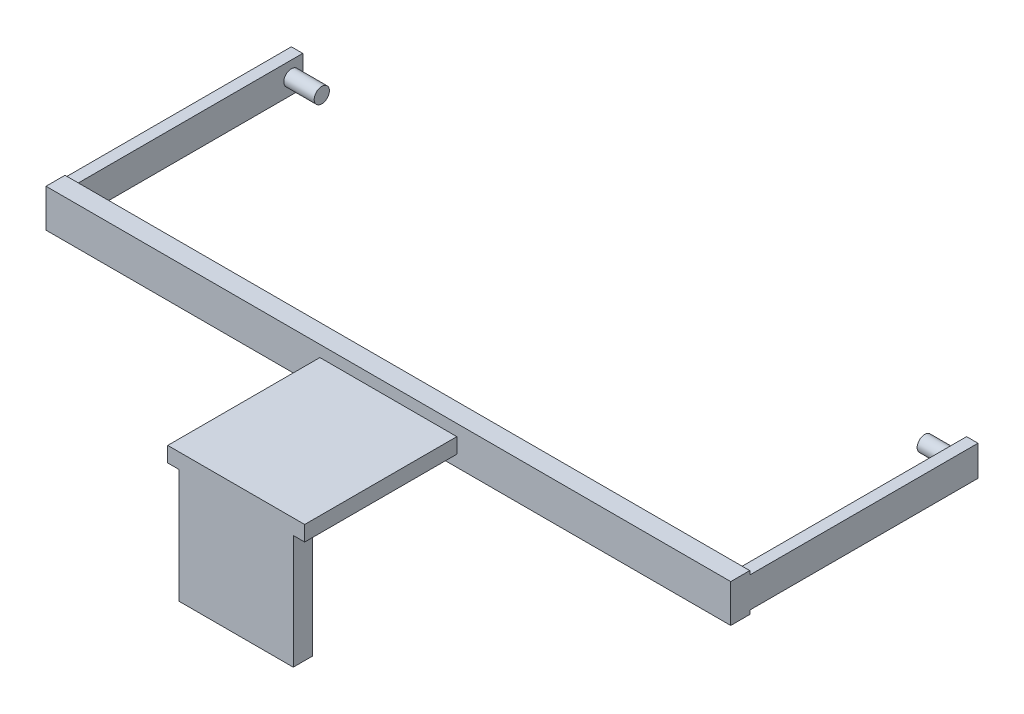
ISO-10303-21;
HEADER;
FILE_DESCRIPTION(('STEP AP214'),'2;1');
FILE_NAME('part.step','',(''),(''),'','','');
FILE_SCHEMA(('AUTOMOTIVE_DESIGN { 1 0 10303 214 1 1 1 1 }'));
ENDSEC;
DATA;
#1=APPLICATION_CONTEXT('core data for automotive mechanical design processes');
#2=APPLICATION_PROTOCOL_DEFINITION('international standard','automotive_design',2000,#1);
#3=PRODUCT_CONTEXT('',#1,'mechanical');
#4=PRODUCT('Part','Part','',(#3));
#5=PRODUCT_RELATED_PRODUCT_CATEGORY('part','',(#4));
#6=PRODUCT_DEFINITION_FORMATION('','',#4);
#7=PRODUCT_DEFINITION_CONTEXT('part definition',#1,'design');
#8=PRODUCT_DEFINITION('design','',#6,#7);
#9=PRODUCT_DEFINITION_SHAPE('','',#8);
#10=(LENGTH_UNIT() NAMED_UNIT(*) SI_UNIT(.MILLI.,.METRE.));
#11=(NAMED_UNIT(*) PLANE_ANGLE_UNIT() SI_UNIT($,.RADIAN.));
#12=(NAMED_UNIT(*) SI_UNIT($,.STERADIAN.) SOLID_ANGLE_UNIT());
#13=UNCERTAINTY_MEASURE_WITH_UNIT(LENGTH_MEASURE(1.E-05),#10,'distance_accuracy_value','');
#14=(GEOMETRIC_REPRESENTATION_CONTEXT(3) GLOBAL_UNCERTAINTY_ASSIGNED_CONTEXT((#13)) GLOBAL_UNIT_ASSIGNED_CONTEXT((#10,
#11,#12)) REPRESENTATION_CONTEXT('',''));
#15=CARTESIAN_POINT('',(0.,0.,0.));
#16=DIRECTION('',(0.,0.,1.));
#17=DIRECTION('',(1.,0.,0.));
#18=AXIS2_PLACEMENT_3D('',#15,#16,#17);
#19=CARTESIAN_POINT('',(-90.,10.,-2.5));
#20=DIRECTION('',(0.,0.,1.));
#21=DIRECTION('',(1.,0.,0.));
#22=AXIS2_PLACEMENT_3D('',#19,#20,#21);
#23=PLANE('',#22);
#24=DIRECTION('',(1.,0.,0.));
#25=VECTOR('',#24,1.);
#26=CARTESIAN_POINT('',(-87.5,9.,-2.5));
#27=LINE('',#26,#25);
#28=CARTESIAN_POINT('',(-90.,9.,-2.5));
#29=VERTEX_POINT('',#28);
#30=CARTESIAN_POINT('',(-87.5,9.,-2.5));
#31=VERTEX_POINT('',#30);
#32=EDGE_CURVE('E380',#29,#31,#27,.T.);
#33=ORIENTED_EDGE('',*,*,#32,.F.);
#34=DIRECTION('',(0.,-1.,0.));
#35=VECTOR('',#34,1.);
#36=CARTESIAN_POINT('',(-90.,10.,-2.5));
#37=LINE('',#36,#35);
#38=CARTESIAN_POINT('',(-90.,10.,-2.5));
#39=VERTEX_POINT('',#38);
#40=EDGE_CURVE('E329',#39,#29,#37,.T.);
#41=ORIENTED_EDGE('',*,*,#40,.F.);
#42=DIRECTION('',(-1.,0.,0.));
#43=VECTOR('',#42,1.);
#44=CARTESIAN_POINT('',(-90.,10.,-2.5));
#45=LINE('',#44,#43);
#46=CARTESIAN_POINT('',(90.,10.,-2.5));
#47=VERTEX_POINT('',#46);
#48=EDGE_CURVE('E307',#47,#39,#45,.T.);
#49=ORIENTED_EDGE('',*,*,#48,.F.);
#50=DIRECTION('',(0.,-1.,0.));
#51=VECTOR('',#50,1.);
#52=CARTESIAN_POINT('',(90.,10.,-2.5));
#53=LINE('',#52,#51);
#54=CARTESIAN_POINT('',(90.,9.,-2.5));
#55=VERTEX_POINT('',#54);
#56=EDGE_CURVE('E334',#47,#55,#53,.T.);
#57=ORIENTED_EDGE('',*,*,#56,.T.);
#58=DIRECTION('',(1.,0.,0.));
#59=VECTOR('',#58,1.);
#60=CARTESIAN_POINT('',(90.,9.,-2.5));
#61=LINE('',#60,#59);
#62=CARTESIAN_POINT('',(87.,9.,-2.5));
#63=VERTEX_POINT('',#62);
#64=EDGE_CURVE('E287',#63,#55,#61,.T.);
#65=ORIENTED_EDGE('',*,*,#64,.F.);
#66=DIRECTION('',(0.,1.,0.));
#67=VECTOR('',#66,1.);
#68=CARTESIAN_POINT('',(87.,1.,-2.5));
#69=LINE('',#68,#67);
#70=CARTESIAN_POINT('',(87.,1.,-2.5));
#71=VERTEX_POINT('',#70);
#72=EDGE_CURVE('E273',#71,#63,#69,.T.);
#73=ORIENTED_EDGE('',*,*,#72,.F.);
#74=DIRECTION('',(-1.,0.,0.));
#75=VECTOR('',#74,1.);
#76=CARTESIAN_POINT('',(90.,1.,-2.5));
#77=LINE('',#76,#75);
#78=CARTESIAN_POINT('',(90.,1.,-2.5));
#79=VERTEX_POINT('',#78);
#80=EDGE_CURVE('E278',#79,#71,#77,.T.);
#81=ORIENTED_EDGE('',*,*,#80,.F.);
#82=CARTESIAN_POINT('',(90.,0.,-2.5));
#83=VERTEX_POINT('',#82);
#84=EDGE_CURVE('E332',#79,#83,#53,.T.);
#85=ORIENTED_EDGE('',*,*,#84,.T.);
#86=DIRECTION('',(-1.,0.,0.));
#87=VECTOR('',#86,1.);
#88=CARTESIAN_POINT('',(-90.,0.,-2.5));
#89=LINE('',#88,#87);
#90=CARTESIAN_POINT('',(-90.,0.,-2.5));
#91=VERTEX_POINT('',#90);
#92=EDGE_CURVE('E317',#83,#91,#89,.T.);
#93=ORIENTED_EDGE('',*,*,#92,.T.);
#94=CARTESIAN_POINT('',(-90.,1.,-2.5));
#95=VERTEX_POINT('',#94);
#96=EDGE_CURVE('E328',#95,#91,#37,.T.);
#97=ORIENTED_EDGE('',*,*,#96,.F.);
#98=DIRECTION('',(-1.,0.,0.));
#99=VECTOR('',#98,1.);
#100=CARTESIAN_POINT('',(-87.5,1.,-2.5));
#101=LINE('',#100,#99);
#102=CARTESIAN_POINT('',(-87.5,1.,-2.5));
#103=VERTEX_POINT('',#102);
#104=EDGE_CURVE('E51',#103,#95,#101,.T.);
#105=ORIENTED_EDGE('',*,*,#104,.F.);
#106=DIRECTION('',(0.,-1.,0.));
#107=VECTOR('',#106,1.);
#108=CARTESIAN_POINT('',(-87.5,1.,-2.5));
#109=LINE('',#108,#107);
#110=EDGE_CURVE('E381',#31,#103,#109,.T.);
#111=ORIENTED_EDGE('',*,*,#110,.F.);
#112=EDGE_LOOP('',(#33,#41,#49,#57,#65,#73,#81,#85,#93,#97,#105,#111));
#113=FACE_BOUND('',#112,.T.);
#114=ADVANCED_FACE('F36',(#113),#23,.F.);
#115=CARTESIAN_POINT('',(-18.,3.,42.5));
#116=DIRECTION('',(0.,1.,0.));
#117=DIRECTION('',(0.,0.,1.));
#118=AXIS2_PLACEMENT_3D('',#115,#116,#117);
#119=PLANE('',#118);
#120=DIRECTION('',(0.,0.,-1.));
#121=VECTOR('',#120,1.);
#122=CARTESIAN_POINT('',(-15.,3.,37.5));
#123=LINE('',#122,#121);
#124=CARTESIAN_POINT('',(-15.,3.,42.5));
#125=VERTEX_POINT('',#124);
#126=CARTESIAN_POINT('',(-15.,3.,37.5));
#127=VERTEX_POINT('',#126);
#128=EDGE_CURVE('E206',#125,#127,#123,.T.);
#129=ORIENTED_EDGE('',*,*,#128,.F.);
#130=DIRECTION('',(1.,0.,0.));
#131=VECTOR('',#130,1.);
#132=CARTESIAN_POINT('',(-18.,3.,42.5));
#133=LINE('',#132,#131);
#134=CARTESIAN_POINT('',(-18.,3.,42.5));
#135=VERTEX_POINT('',#134);
#136=EDGE_CURVE('E245',#135,#125,#133,.T.);
#137=ORIENTED_EDGE('',*,*,#136,.F.);
#138=DIRECTION('',(0.,0.,-1.));
#139=VECTOR('',#138,1.);
#140=CARTESIAN_POINT('',(-18.,3.,42.5));
#141=LINE('',#140,#139);
#142=CARTESIAN_POINT('',(-18.,3.,2.5));
#143=VERTEX_POINT('',#142);
#144=EDGE_CURVE('E261',#135,#143,#141,.T.);
#145=ORIENTED_EDGE('',*,*,#144,.T.);
#146=DIRECTION('',(1.,0.,0.));
#147=VECTOR('',#146,1.);
#148=CARTESIAN_POINT('',(-18.,3.,2.5));
#149=LINE('',#148,#147);
#150=CARTESIAN_POINT('',(18.,3.,2.5));
#151=VERTEX_POINT('',#150);
#152=EDGE_CURVE('E240',#143,#151,#149,.T.);
#153=ORIENTED_EDGE('',*,*,#152,.T.);
#154=DIRECTION('',(0.,0.,-1.));
#155=VECTOR('',#154,1.);
#156=CARTESIAN_POINT('',(18.,3.,42.5));
#157=LINE('',#156,#155);
#158=CARTESIAN_POINT('',(18.,3.,42.5));
#159=VERTEX_POINT('',#158);
#160=EDGE_CURVE('E248',#159,#151,#157,.T.);
#161=ORIENTED_EDGE('',*,*,#160,.F.);
#162=CARTESIAN_POINT('',(15.,3.,42.5));
#163=VERTEX_POINT('',#162);
#164=EDGE_CURVE('E244',#163,#159,#133,.T.);
#165=ORIENTED_EDGE('',*,*,#164,.F.);
#166=DIRECTION('',(0.,0.,1.));
#167=VECTOR('',#166,1.);
#168=CARTESIAN_POINT('',(15.,3.,37.5));
#169=LINE('',#168,#167);
#170=CARTESIAN_POINT('',(15.,3.,37.5));
#171=VERTEX_POINT('',#170);
#172=EDGE_CURVE('E219',#171,#163,#169,.T.);
#173=ORIENTED_EDGE('',*,*,#172,.F.);
#174=DIRECTION('',(1.,0.,0.));
#175=VECTOR('',#174,1.);
#176=CARTESIAN_POINT('',(15.,3.,37.5));
#177=LINE('',#176,#175);
#178=EDGE_CURVE('E209',#127,#171,#177,.T.);
#179=ORIENTED_EDGE('',*,*,#178,.F.);
#180=EDGE_LOOP('',(#129,#137,#145,#153,#161,#165,#173,#179));
#181=FACE_BOUND('',#180,.T.);
#182=ADVANCED_FACE('F418',(#181),#119,.F.);
#183=CARTESIAN_POINT('',(-90.,10.,2.5));
#184=DIRECTION('',(0.,0.,-1.));
#185=DIRECTION('',(-1.,0.,0.));
#186=AXIS2_PLACEMENT_3D('',#183,#184,#185);
#187=PLANE('',#186);
#188=DIRECTION('',(1.,0.,0.));
#189=VECTOR('',#188,1.);
#190=CARTESIAN_POINT('',(-90.,0.,2.5));
#191=LINE('',#190,#189);
#192=CARTESIAN_POINT('',(-90.,0.,2.5));
#193=VERTEX_POINT('',#192);
#194=CARTESIAN_POINT('',(90.,0.,2.5));
#195=VERTEX_POINT('',#194);
#196=EDGE_CURVE('E308',#193,#195,#191,.T.);
#197=ORIENTED_EDGE('',*,*,#196,.T.);
#198=DIRECTION('',(0.,-1.,0.));
#199=VECTOR('',#198,1.);
#200=CARTESIAN_POINT('',(90.,10.,2.5));
#201=LINE('',#200,#199);
#202=CARTESIAN_POINT('',(90.,10.,2.5));
#203=VERTEX_POINT('',#202);
#204=EDGE_CURVE('E314',#203,#195,#201,.T.);
#205=ORIENTED_EDGE('',*,*,#204,.F.);
#206=DIRECTION('',(1.,0.,0.));
#207=VECTOR('',#206,1.);
#208=CARTESIAN_POINT('',(-90.,10.,2.5));
#209=LINE('',#208,#207);
#210=CARTESIAN_POINT('',(-90.,10.,2.5));
#211=VERTEX_POINT('',#210);
#212=EDGE_CURVE('E312',#211,#203,#209,.T.);
#213=ORIENTED_EDGE('',*,*,#212,.F.);
#214=DIRECTION('',(0.,-1.,0.));
#215=VECTOR('',#214,1.);
#216=CARTESIAN_POINT('',(-90.,10.,2.5));
#217=LINE('',#216,#215);
#218=EDGE_CURVE('E325',#211,#193,#217,.T.);
#219=ORIENTED_EDGE('',*,*,#218,.T.);
#220=EDGE_LOOP('',(#197,#205,#213,#219));
#221=FACE_BOUND('',#220,.T.);
#222=DIRECTION('',(0.,1.,0.));
#223=VECTOR('',#222,1.);
#224=CARTESIAN_POINT('',(18.,7.,2.5));
#225=LINE('',#224,#223);
#226=CARTESIAN_POINT('',(18.,7.,2.5));
#227=VERTEX_POINT('',#226);
#228=EDGE_CURVE('E235',#151,#227,#225,.T.);
#229=ORIENTED_EDGE('',*,*,#228,.F.);
#230=ORIENTED_EDGE('',*,*,#152,.F.);
#231=DIRECTION('',(0.,-1.,0.));
#232=VECTOR('',#231,1.);
#233=CARTESIAN_POINT('',(-18.,7.,2.5));
#234=LINE('',#233,#232);
#235=CARTESIAN_POINT('',(-18.,7.,2.5));
#236=VERTEX_POINT('',#235);
#237=EDGE_CURVE('E254',#236,#143,#234,.T.);
#238=ORIENTED_EDGE('',*,*,#237,.F.);
#239=DIRECTION('',(-1.,0.,0.));
#240=VECTOR('',#239,1.);
#241=CARTESIAN_POINT('',(-18.,7.,2.5));
#242=LINE('',#241,#240);
#243=EDGE_CURVE('E251',#227,#236,#242,.T.);
#244=ORIENTED_EDGE('',*,*,#243,.F.);
#245=EDGE_LOOP('',(#229,#230,#238,#244));
#246=FACE_BOUND('',#245,.T.);
#247=ADVANCED_FACE('F371',(#221,#246),#187,.F.);
#248=CARTESIAN_POINT('',(90.,10.,-2.5));
#249=DIRECTION('',(-1.,0.,0.));
#250=DIRECTION('',(0.,0.,1.));
#251=AXIS2_PLACEMENT_3D('',#248,#249,#250);
#252=PLANE('',#251);
#253=DIRECTION('',(0.,0.,-1.));
#254=VECTOR('',#253,1.);
#255=CARTESIAN_POINT('',(90.,0.,-2.5));
#256=LINE('',#255,#254);
#257=EDGE_CURVE('E303',#195,#83,#256,.T.);
#258=ORIENTED_EDGE('',*,*,#257,.T.);
#259=ORIENTED_EDGE('',*,*,#84,.F.);
#260=DIRECTION('',(0.,0.,1.));
#261=VECTOR('',#260,1.);
#262=CARTESIAN_POINT('',(90.,1.,-62.5));
#263=LINE('',#262,#261);
#264=CARTESIAN_POINT('',(90.,1.,-62.5));
#265=VERTEX_POINT('',#264);
#266=EDGE_CURVE('E294',#265,#79,#263,.T.);
#267=ORIENTED_EDGE('',*,*,#266,.F.);
#268=DIRECTION('',(0.,-1.,0.));
#269=VECTOR('',#268,1.);
#270=CARTESIAN_POINT('',(90.,1.,-62.5));
#271=LINE('',#270,#269);
#272=CARTESIAN_POINT('',(90.,9.,-62.5));
#273=VERTEX_POINT('',#272);
#274=EDGE_CURVE('E280',#273,#265,#271,.T.);
#275=ORIENTED_EDGE('',*,*,#274,.F.);
#276=DIRECTION('',(0.,0.,1.));
#277=VECTOR('',#276,1.);
#278=CARTESIAN_POINT('',(90.,9.,-62.5));
#279=LINE('',#278,#277);
#280=EDGE_CURVE('E297',#273,#55,#279,.T.);
#281=ORIENTED_EDGE('',*,*,#280,.T.);
#282=ORIENTED_EDGE('',*,*,#56,.F.);
#283=DIRECTION('',(0.,0.,-1.));
#284=VECTOR('',#283,1.);
#285=CARTESIAN_POINT('',(90.,10.,-2.5));
#286=LINE('',#285,#284);
#287=EDGE_CURVE('E304',#203,#47,#286,.T.);
#288=ORIENTED_EDGE('',*,*,#287,.F.);
#289=ORIENTED_EDGE('',*,*,#204,.T.);
#290=EDGE_LOOP('',(#258,#259,#267,#275,#281,#282,#288,#289));
#291=FACE_BOUND('',#290,.T.);
#292=ADVANCED_FACE('F38',(#291),#252,.F.);
#293=CARTESIAN_POINT('',(-90.,10.,-2.5));
#294=DIRECTION('',(1.,0.,0.));
#295=DIRECTION('',(0.,0.,-1.));
#296=AXIS2_PLACEMENT_3D('',#293,#294,#295);
#297=PLANE('',#296);
#298=DIRECTION('',(0.,0.,1.));
#299=VECTOR('',#298,1.);
#300=CARTESIAN_POINT('',(-90.,0.,-2.5));
#301=LINE('',#300,#299);
#302=EDGE_CURVE('E320',#91,#193,#301,.T.);
#303=ORIENTED_EDGE('',*,*,#302,.T.);
#304=ORIENTED_EDGE('',*,*,#218,.F.);
#305=DIRECTION('',(0.,0.,1.));
#306=VECTOR('',#305,1.);
#307=CARTESIAN_POINT('',(-90.,10.,-2.5));
#308=LINE('',#307,#306);
#309=EDGE_CURVE('E310',#39,#211,#308,.T.);
#310=ORIENTED_EDGE('',*,*,#309,.F.);
#311=ORIENTED_EDGE('',*,*,#40,.T.);
#312=EDGE_CURVE('E333',#29,#95,#37,.T.);
#313=ORIENTED_EDGE('',*,*,#312,.T.);
#314=ORIENTED_EDGE('',*,*,#96,.T.);
#315=EDGE_LOOP('',(#303,#304,#310,#311,#313,#314));
#316=FACE_BOUND('',#315,.T.);
#317=ADVANCED_FACE('F366',(#316),#297,.F.);
#318=CARTESIAN_POINT('',(0.,10.,0.));
#319=DIRECTION('',(0.,1.,0.));
#320=DIRECTION('',(0.,0.,1.));
#321=AXIS2_PLACEMENT_3D('',#318,#319,#320);
#322=PLANE('',#321);
#323=ORIENTED_EDGE('',*,*,#287,.T.);
#324=ORIENTED_EDGE('',*,*,#48,.T.);
#325=ORIENTED_EDGE('',*,*,#309,.T.);
#326=ORIENTED_EDGE('',*,*,#212,.T.);
#327=EDGE_LOOP('',(#323,#324,#325,#326));
#328=FACE_BOUND('',#327,.T.);
#329=ADVANCED_FACE('F376',(#328),#322,.T.);
#330=CARTESIAN_POINT('',(0.,0.,0.));
#331=DIRECTION('',(0.,1.,0.));
#332=DIRECTION('',(0.,0.,1.));
#333=AXIS2_PLACEMENT_3D('',#330,#331,#332);
#334=PLANE('',#333);
#335=ORIENTED_EDGE('',*,*,#257,.F.);
#336=ORIENTED_EDGE('',*,*,#196,.F.);
#337=ORIENTED_EDGE('',*,*,#302,.F.);
#338=ORIENTED_EDGE('',*,*,#92,.F.);
#339=EDGE_LOOP('',(#335,#336,#337,#338));
#340=FACE_BOUND('',#339,.T.);
#341=ADVANCED_FACE('F344',(#340),#334,.F.);
#342=CARTESIAN_POINT('',(87.,1.,-62.5));
#343=DIRECTION('',(1.,0.,0.));
#344=DIRECTION('',(0.,0.,-1.));
#345=AXIS2_PLACEMENT_3D('',#342,#343,#344);
#346=PLANE('',#345);
#347=CARTESIAN_POINT('',(87.,5.,-59.5));
#348=DIRECTION('',(1.,0.,0.));
#349=DIRECTION('',(0.,0.,-1.));
#350=AXIS2_PLACEMENT_3D('',#347,#348,#349);
#351=CIRCLE('',#350,2.);
#352=CARTESIAN_POINT('',(87.,5.,-61.5));
#353=VERTEX_POINT('',#352);
#354=EDGE_CURVE('E44',#353,#353,#351,.F.);
#355=ORIENTED_EDGE('',*,*,#354,.F.);
#356=EDGE_LOOP('',(#355));
#357=FACE_BOUND('',#356,.T.);
#358=ORIENTED_EDGE('',*,*,#72,.T.);
#359=DIRECTION('',(0.,0.,1.));
#360=VECTOR('',#359,1.);
#361=CARTESIAN_POINT('',(87.,9.,-62.5));
#362=LINE('',#361,#360);
#363=CARTESIAN_POINT('',(87.,9.,-62.5));
#364=VERTEX_POINT('',#363);
#365=EDGE_CURVE('E300',#364,#63,#362,.T.);
#366=ORIENTED_EDGE('',*,*,#365,.F.);
#367=DIRECTION('',(0.,1.,0.));
#368=VECTOR('',#367,1.);
#369=CARTESIAN_POINT('',(87.,1.,-62.5));
#370=LINE('',#369,#368);
#371=CARTESIAN_POINT('',(87.,1.,-62.5));
#372=VERTEX_POINT('',#371);
#373=EDGE_CURVE('E274',#372,#364,#370,.T.);
#374=ORIENTED_EDGE('',*,*,#373,.F.);
#375=DIRECTION('',(0.,0.,1.));
#376=VECTOR('',#375,1.);
#377=CARTESIAN_POINT('',(87.,1.,-62.5));
#378=LINE('',#377,#376);
#379=EDGE_CURVE('E284',#372,#71,#378,.T.);
#380=ORIENTED_EDGE('',*,*,#379,.T.);
#381=EDGE_LOOP('',(#358,#366,#374,#380));
#382=FACE_BOUND('',#381,.T.);
#383=ADVANCED_FACE('F340',(#357,#382),#346,.F.);
#384=CARTESIAN_POINT('',(90.,9.,-62.5));
#385=DIRECTION('',(0.,-1.,0.));
#386=DIRECTION('',(0.,0.,-1.));
#387=AXIS2_PLACEMENT_3D('',#384,#385,#386);
#388=PLANE('',#387);
#389=ORIENTED_EDGE('',*,*,#64,.T.);
#390=ORIENTED_EDGE('',*,*,#280,.F.);
#391=DIRECTION('',(1.,0.,0.));
#392=VECTOR('',#391,1.);
#393=CARTESIAN_POINT('',(90.,9.,-62.5));
#394=LINE('',#393,#392);
#395=EDGE_CURVE('E277',#364,#273,#394,.T.);
#396=ORIENTED_EDGE('',*,*,#395,.F.);
#397=ORIENTED_EDGE('',*,*,#365,.T.);
#398=EDGE_LOOP('',(#389,#390,#396,#397));
#399=FACE_BOUND('',#398,.T.);
#400=ADVANCED_FACE('F343',(#399),#388,.F.);
#401=CARTESIAN_POINT('',(90.,1.,-62.5));
#402=DIRECTION('',(0.,1.,0.));
#403=DIRECTION('',(-1.,0.,0.));
#404=AXIS2_PLACEMENT_3D('',#401,#402,#403);
#405=PLANE('',#404);
#406=ORIENTED_EDGE('',*,*,#80,.T.);
#407=ORIENTED_EDGE('',*,*,#379,.F.);
#408=DIRECTION('',(-1.,0.,0.));
#409=VECTOR('',#408,1.);
#410=CARTESIAN_POINT('',(90.,1.,-62.5));
#411=LINE('',#410,#409);
#412=EDGE_CURVE('E282',#265,#372,#411,.T.);
#413=ORIENTED_EDGE('',*,*,#412,.F.);
#414=ORIENTED_EDGE('',*,*,#266,.T.);
#415=EDGE_LOOP('',(#406,#407,#413,#414));
#416=FACE_BOUND('',#415,.T.);
#417=ADVANCED_FACE('F353',(#416),#405,.F.);
#418=CARTESIAN_POINT('',(0.,0.,-62.5));
#419=DIRECTION('',(0.,0.,1.));
#420=DIRECTION('',(1.,0.,0.));
#421=AXIS2_PLACEMENT_3D('',#418,#419,#420);
#422=PLANE('',#421);
#423=ORIENTED_EDGE('',*,*,#373,.T.);
#424=ORIENTED_EDGE('',*,*,#395,.T.);
#425=ORIENTED_EDGE('',*,*,#274,.T.);
#426=ORIENTED_EDGE('',*,*,#412,.T.);
#427=EDGE_LOOP('',(#423,#424,#425,#426));
#428=FACE_BOUND('',#427,.T.);
#429=ADVANCED_FACE('F438',(#428),#422,.F.);
#430=CARTESIAN_POINT('',(79.,5.,-59.5));
#431=DIRECTION('',(1.,0.,0.));
#432=DIRECTION('',(0.,0.,-1.));
#433=AXIS2_PLACEMENT_3D('',#430,#431,#432);
#434=CYLINDRICAL_SURFACE('',#433,2.);
#435=CARTESIAN_POINT('',(79.,5.,-59.5));
#436=DIRECTION('',(-1.,0.,0.));
#437=DIRECTION('',(0.,0.,1.));
#438=AXIS2_PLACEMENT_3D('',#435,#436,#437);
#439=CIRCLE('',#438,2.);
#440=CARTESIAN_POINT('',(79.,5.,-57.5));
#441=VERTEX_POINT('',#440);
#442=EDGE_CURVE('E270',#441,#441,#439,.T.);
#443=ORIENTED_EDGE('',*,*,#442,.F.);
#444=EDGE_LOOP('',(#443));
#445=FACE_BOUND('',#444,.T.);
#446=ORIENTED_EDGE('',*,*,#354,.T.);
#447=EDGE_LOOP('',(#446));
#448=FACE_BOUND('',#447,.T.);
#449=ADVANCED_FACE('F338',(#445,#448),#434,.T.);
#450=CARTESIAN_POINT('',(79.,5.,-59.5));
#451=DIRECTION('',(-1.,0.,0.));
#452=DIRECTION('',(0.,0.,1.));
#453=AXIS2_PLACEMENT_3D('',#450,#451,#452);
#454=PLANE('',#453);
#455=ORIENTED_EDGE('',*,*,#442,.T.);
#456=EDGE_LOOP('',(#455));
#457=FACE_BOUND('',#456,.T.);
#458=ADVANCED_FACE('F444',(#457),#454,.T.);
#459=CARTESIAN_POINT('',(18.,7.,42.5));
#460=DIRECTION('',(-1.,0.,0.));
#461=DIRECTION('',(0.,0.,1.));
#462=AXIS2_PLACEMENT_3D('',#459,#460,#461);
#463=PLANE('',#462);
#464=ORIENTED_EDGE('',*,*,#228,.T.);
#465=DIRECTION('',(0.,0.,-1.));
#466=VECTOR('',#465,1.);
#467=CARTESIAN_POINT('',(18.,7.,42.5));
#468=LINE('',#467,#466);
#469=CARTESIAN_POINT('',(18.,7.,42.5));
#470=VERTEX_POINT('',#469);
#471=EDGE_CURVE('E267',#470,#227,#468,.T.);
#472=ORIENTED_EDGE('',*,*,#471,.F.);
#473=DIRECTION('',(0.,1.,0.));
#474=VECTOR('',#473,1.);
#475=CARTESIAN_POINT('',(18.,7.,42.5));
#476=LINE('',#475,#474);
#477=EDGE_CURVE('E236',#159,#470,#476,.T.);
#478=ORIENTED_EDGE('',*,*,#477,.F.);
#479=ORIENTED_EDGE('',*,*,#160,.T.);
#480=EDGE_LOOP('',(#464,#472,#478,#479));
#481=FACE_BOUND('',#480,.T.);
#482=ADVANCED_FACE('F448',(#481),#463,.F.);
#483=CARTESIAN_POINT('',(-18.,7.,42.5));
#484=DIRECTION('',(0.,-1.,0.));
#485=DIRECTION('',(0.,0.,-1.));
#486=AXIS2_PLACEMENT_3D('',#483,#484,#485);
#487=PLANE('',#486);
#488=ORIENTED_EDGE('',*,*,#243,.T.);
#489=DIRECTION('',(0.,0.,-1.));
#490=VECTOR('',#489,1.);
#491=CARTESIAN_POINT('',(-18.,7.,42.5));
#492=LINE('',#491,#490);
#493=CARTESIAN_POINT('',(-18.,7.,42.5));
#494=VERTEX_POINT('',#493);
#495=EDGE_CURVE('E264',#494,#236,#492,.T.);
#496=ORIENTED_EDGE('',*,*,#495,.F.);
#497=DIRECTION('',(-1.,0.,0.));
#498=VECTOR('',#497,1.);
#499=CARTESIAN_POINT('',(-18.,7.,42.5));
#500=LINE('',#499,#498);
#501=EDGE_CURVE('E239',#470,#494,#500,.T.);
#502=ORIENTED_EDGE('',*,*,#501,.F.);
#503=ORIENTED_EDGE('',*,*,#471,.T.);
#504=EDGE_LOOP('',(#488,#496,#502,#503));
#505=FACE_BOUND('',#504,.T.);
#506=ADVANCED_FACE('F452',(#505),#487,.F.);
#507=CARTESIAN_POINT('',(-18.,7.,42.5));
#508=DIRECTION('',(1.,0.,0.));
#509=DIRECTION('',(0.,1.,0.));
#510=AXIS2_PLACEMENT_3D('',#507,#508,#509);
#511=PLANE('',#510);
#512=ORIENTED_EDGE('',*,*,#237,.T.);
#513=ORIENTED_EDGE('',*,*,#144,.F.);
#514=DIRECTION('',(0.,-1.,0.));
#515=VECTOR('',#514,1.);
#516=CARTESIAN_POINT('',(-18.,7.,42.5));
#517=LINE('',#516,#515);
#518=EDGE_CURVE('E242',#494,#135,#517,.T.);
#519=ORIENTED_EDGE('',*,*,#518,.F.);
#520=ORIENTED_EDGE('',*,*,#495,.T.);
#521=EDGE_LOOP('',(#512,#513,#519,#520));
#522=FACE_BOUND('',#521,.T.);
#523=ADVANCED_FACE('F456',(#522),#511,.F.);
#524=CARTESIAN_POINT('',(0.,0.,42.5));
#525=DIRECTION('',(0.,0.,1.));
#526=DIRECTION('',(1.,0.,0.));
#527=AXIS2_PLACEMENT_3D('',#524,#525,#526);
#528=PLANE('',#527);
#529=ORIENTED_EDGE('',*,*,#477,.T.);
#530=ORIENTED_EDGE('',*,*,#501,.T.);
#531=ORIENTED_EDGE('',*,*,#518,.T.);
#532=ORIENTED_EDGE('',*,*,#136,.T.);
#533=DIRECTION('',(0.,1.,0.));
#534=VECTOR('',#533,1.);
#535=CARTESIAN_POINT('',(-15.,-27.,42.5));
#536=LINE('',#535,#534);
#537=CARTESIAN_POINT('',(-15.,-27.,42.5));
#538=VERTEX_POINT('',#537);
#539=EDGE_CURVE('E224',#538,#125,#536,.T.);
#540=ORIENTED_EDGE('',*,*,#539,.F.);
#541=DIRECTION('',(-1.,0.,0.));
#542=VECTOR('',#541,1.);
#543=CARTESIAN_POINT('',(15.,-27.,42.5));
#544=LINE('',#543,#542);
#545=CARTESIAN_POINT('',(15.,-27.,42.5));
#546=VERTEX_POINT('',#545);
#547=EDGE_CURVE('E223',#546,#538,#544,.T.);
#548=ORIENTED_EDGE('',*,*,#547,.F.);
#549=DIRECTION('',(0.,1.,0.));
#550=VECTOR('',#549,1.);
#551=CARTESIAN_POINT('',(15.,-27.,42.5));
#552=LINE('',#551,#550);
#553=EDGE_CURVE('E59',#546,#163,#552,.T.);
#554=ORIENTED_EDGE('',*,*,#553,.T.);
#555=ORIENTED_EDGE('',*,*,#164,.T.);
#556=EDGE_LOOP('',(#529,#530,#531,#532,#540,#548,#554,#555));
#557=FACE_BOUND('',#556,.T.);
#558=ADVANCED_FACE('F459',(#557),#528,.T.);
#559=CARTESIAN_POINT('',(-15.,-27.,37.5));
#560=DIRECTION('',(1.,0.,0.));
#561=DIRECTION('',(0.,0.,-1.));
#562=AXIS2_PLACEMENT_3D('',#559,#560,#561);
#563=PLANE('',#562);
#564=ORIENTED_EDGE('',*,*,#128,.T.);
#565=DIRECTION('',(0.,1.,0.));
#566=VECTOR('',#565,1.);
#567=CARTESIAN_POINT('',(-15.,-27.,37.5));
#568=LINE('',#567,#566);
#569=CARTESIAN_POINT('',(-15.,-27.,37.5));
#570=VERTEX_POINT('',#569);
#571=EDGE_CURVE('E233',#570,#127,#568,.T.);
#572=ORIENTED_EDGE('',*,*,#571,.F.);
#573=DIRECTION('',(0.,0.,-1.));
#574=VECTOR('',#573,1.);
#575=CARTESIAN_POINT('',(-15.,-27.,37.5));
#576=LINE('',#575,#574);
#577=EDGE_CURVE('E215',#538,#570,#576,.T.);
#578=ORIENTED_EDGE('',*,*,#577,.F.);
#579=ORIENTED_EDGE('',*,*,#539,.T.);
#580=EDGE_LOOP('',(#564,#572,#578,#579));
#581=FACE_BOUND('',#580,.T.);
#582=ADVANCED_FACE('F464',(#581),#563,.F.);
#583=CARTESIAN_POINT('',(15.,-27.,37.5));
#584=DIRECTION('',(0.,0.,1.));
#585=DIRECTION('',(1.,0.,0.));
#586=AXIS2_PLACEMENT_3D('',#583,#584,#585);
#587=PLANE('',#586);
#588=ORIENTED_EDGE('',*,*,#178,.T.);
#589=DIRECTION('',(0.,1.,0.));
#590=VECTOR('',#589,1.);
#591=CARTESIAN_POINT('',(15.,-27.,37.5));
#592=LINE('',#591,#590);
#593=CARTESIAN_POINT('',(15.,-27.,37.5));
#594=VERTEX_POINT('',#593);
#595=EDGE_CURVE('E230',#594,#171,#592,.T.);
#596=ORIENTED_EDGE('',*,*,#595,.F.);
#597=DIRECTION('',(1.,0.,0.));
#598=VECTOR('',#597,1.);
#599=CARTESIAN_POINT('',(15.,-27.,37.5));
#600=LINE('',#599,#598);
#601=EDGE_CURVE('E218',#570,#594,#600,.T.);
#602=ORIENTED_EDGE('',*,*,#601,.F.);
#603=ORIENTED_EDGE('',*,*,#571,.T.);
#604=EDGE_LOOP('',(#588,#596,#602,#603));
#605=FACE_BOUND('',#604,.T.);
#606=ADVANCED_FACE('F467',(#605),#587,.F.);
#607=CARTESIAN_POINT('',(15.,-27.,37.5));
#608=DIRECTION('',(-1.,0.,0.));
#609=DIRECTION('',(0.,0.,1.));
#610=AXIS2_PLACEMENT_3D('',#607,#608,#609);
#611=PLANE('',#610);
#612=ORIENTED_EDGE('',*,*,#172,.T.);
#613=ORIENTED_EDGE('',*,*,#553,.F.);
#614=DIRECTION('',(0.,0.,1.));
#615=VECTOR('',#614,1.);
#616=CARTESIAN_POINT('',(15.,-27.,37.5));
#617=LINE('',#616,#615);
#618=EDGE_CURVE('E221',#594,#546,#617,.T.);
#619=ORIENTED_EDGE('',*,*,#618,.F.);
#620=ORIENTED_EDGE('',*,*,#595,.T.);
#621=EDGE_LOOP('',(#612,#613,#619,#620));
#622=FACE_BOUND('',#621,.T.);
#623=ADVANCED_FACE('F471',(#622),#611,.F.);
#624=CARTESIAN_POINT('',(0.,-27.,0.));
#625=DIRECTION('',(0.,-1.,0.));
#626=DIRECTION('',(0.,0.,-1.));
#627=AXIS2_PLACEMENT_3D('',#624,#625,#626);
#628=PLANE('',#627);
#629=ORIENTED_EDGE('',*,*,#577,.T.);
#630=ORIENTED_EDGE('',*,*,#601,.T.);
#631=ORIENTED_EDGE('',*,*,#618,.T.);
#632=ORIENTED_EDGE('',*,*,#547,.T.);
#633=EDGE_LOOP('',(#629,#630,#631,#632));
#634=FACE_BOUND('',#633,.T.);
#635=ADVANCED_FACE('F475',(#634),#628,.T.);
#636=CARTESIAN_POINT('',(-177.5,0.,-2.5));
#637=DIRECTION('',(0.,0.,1.));
#638=DIRECTION('',(1.,0.,0.));
#639=AXIS2_PLACEMENT_3D('',#636,#637,#638);
#640=PLANE('',#639);
#641=ORIENTED_EDGE('',*,*,#312,.F.);
#642=CARTESIAN_POINT('',(-90.5,9.,-2.5));
#643=VERTEX_POINT('',#642);
#644=EDGE_CURVE('E382',#643,#29,#27,.T.);
#645=ORIENTED_EDGE('',*,*,#644,.F.);
#646=DIRECTION('',(0.,1.,0.));
#647=VECTOR('',#646,1.);
#648=CARTESIAN_POINT('',(-90.5,1.,-2.5));
#649=LINE('',#648,#647);
#650=CARTESIAN_POINT('',(-90.5,1.,-2.5));
#651=VERTEX_POINT('',#650);
#652=EDGE_CURVE('E205',#651,#643,#649,.T.);
#653=ORIENTED_EDGE('',*,*,#652,.F.);
#654=EDGE_CURVE('E389',#95,#651,#101,.T.);
#655=ORIENTED_EDGE('',*,*,#654,.F.);
#656=EDGE_LOOP('',(#641,#645,#653,#655));
#657=FACE_BOUND('',#656,.T.);
#658=ADVANCED_FACE('F479',(#657),#640,.T.);
#659=CARTESIAN_POINT('',(-90.5,1.,-62.5));
#660=DIRECTION('',(1.,0.,0.));
#661=DIRECTION('',(0.,0.,-1.));
#662=AXIS2_PLACEMENT_3D('',#659,#660,#661);
#663=PLANE('',#662);
#664=ORIENTED_EDGE('',*,*,#652,.T.);
#665=DIRECTION('',(0.,0.,1.));
#666=VECTOR('',#665,1.);
#667=CARTESIAN_POINT('',(-90.5,9.,-62.5));
#668=LINE('',#667,#666);
#669=CARTESIAN_POINT('',(-90.5,9.,-62.5));
#670=VERTEX_POINT('',#669);
#671=EDGE_CURVE('E186',#670,#643,#668,.T.);
#672=ORIENTED_EDGE('',*,*,#671,.F.);
#673=DIRECTION('',(0.,1.,0.));
#674=VECTOR('',#673,1.);
#675=CARTESIAN_POINT('',(-90.5,1.,-62.5));
#676=LINE('',#675,#674);
#677=CARTESIAN_POINT('',(-90.5,1.,-62.5));
#678=VERTEX_POINT('',#677);
#679=EDGE_CURVE('E193',#678,#670,#676,.T.);
#680=ORIENTED_EDGE('',*,*,#679,.F.);
#681=DIRECTION('',(0.,0.,1.));
#682=VECTOR('',#681,1.);
#683=CARTESIAN_POINT('',(-90.5,1.,-62.5));
#684=LINE('',#683,#682);
#685=EDGE_CURVE('E391',#678,#651,#684,.T.);
#686=ORIENTED_EDGE('',*,*,#685,.T.);
#687=EDGE_LOOP('',(#664,#672,#680,#686));
#688=FACE_BOUND('',#687,.T.);
#689=ADVANCED_FACE('F203',(#688),#663,.F.);
#690=CARTESIAN_POINT('',(-87.5,9.,-62.5));
#691=DIRECTION('',(0.,-1.,0.));
#692=DIRECTION('',(0.,0.,-1.));
#693=AXIS2_PLACEMENT_3D('',#690,#691,#692);
#694=PLANE('',#693);
#695=ORIENTED_EDGE('',*,*,#644,.T.);
#696=ORIENTED_EDGE('',*,*,#32,.T.);
#697=DIRECTION('',(0.,0.,1.));
#698=VECTOR('',#697,1.);
#699=CARTESIAN_POINT('',(-87.5,9.,-62.5));
#700=LINE('',#699,#698);
#701=CARTESIAN_POINT('',(-87.5,9.,-62.5));
#702=VERTEX_POINT('',#701);
#703=EDGE_CURVE('E189',#702,#31,#700,.T.);
#704=ORIENTED_EDGE('',*,*,#703,.F.);
#705=DIRECTION('',(1.,0.,0.));
#706=VECTOR('',#705,1.);
#707=CARTESIAN_POINT('',(-87.5,9.,-62.5));
#708=LINE('',#707,#706);
#709=EDGE_CURVE('E181',#670,#702,#708,.T.);
#710=ORIENTED_EDGE('',*,*,#709,.F.);
#711=ORIENTED_EDGE('',*,*,#671,.T.);
#712=EDGE_LOOP('',(#695,#696,#704,#710,#711));
#713=FACE_BOUND('',#712,.T.);
#714=ADVANCED_FACE('F184',(#713),#694,.F.);
#715=CARTESIAN_POINT('',(-87.5,1.,-62.5));
#716=DIRECTION('',(-1.,0.,0.));
#717=DIRECTION('',(0.,0.,1.));
#718=AXIS2_PLACEMENT_3D('',#715,#716,#717);
#719=PLANE('',#718);
#720=CARTESIAN_POINT('',(-87.5,5.,-59.5));
#721=DIRECTION('',(-1.,0.,0.));
#722=DIRECTION('',(0.,0.,1.));
#723=AXIS2_PLACEMENT_3D('',#720,#721,#722);
#724=CIRCLE('',#723,2.);
#725=CARTESIAN_POINT('',(-87.5,5.,-57.5));
#726=VERTEX_POINT('',#725);
#727=EDGE_CURVE('E11',#726,#726,#724,.F.);
#728=ORIENTED_EDGE('',*,*,#727,.F.);
#729=EDGE_LOOP('',(#728));
#730=FACE_BOUND('',#729,.T.);
#731=ORIENTED_EDGE('',*,*,#110,.T.);
#732=DIRECTION('',(0.,0.,1.));
#733=VECTOR('',#732,1.);
#734=CARTESIAN_POINT('',(-87.5,1.,-62.5));
#735=LINE('',#734,#733);
#736=CARTESIAN_POINT('',(-87.5,1.,-62.5));
#737=VERTEX_POINT('',#736);
#738=EDGE_CURVE('E211',#737,#103,#735,.T.);
#739=ORIENTED_EDGE('',*,*,#738,.F.);
#740=DIRECTION('',(0.,-1.,0.));
#741=VECTOR('',#740,1.);
#742=CARTESIAN_POINT('',(-87.5,1.,-62.5));
#743=LINE('',#742,#741);
#744=EDGE_CURVE('E192',#702,#737,#743,.T.);
#745=ORIENTED_EDGE('',*,*,#744,.F.);
#746=ORIENTED_EDGE('',*,*,#703,.T.);
#747=EDGE_LOOP('',(#731,#739,#745,#746));
#748=FACE_BOUND('',#747,.T.);
#749=ADVANCED_FACE('F395',(#730,#748),#719,.F.);
#750=CARTESIAN_POINT('',(-87.5,1.,-62.5));
#751=DIRECTION('',(0.,1.,0.));
#752=DIRECTION('',(-1.,0.,0.));
#753=AXIS2_PLACEMENT_3D('',#750,#751,#752);
#754=PLANE('',#753);
#755=ORIENTED_EDGE('',*,*,#104,.T.);
#756=ORIENTED_EDGE('',*,*,#654,.T.);
#757=ORIENTED_EDGE('',*,*,#685,.F.);
#758=DIRECTION('',(-1.,0.,0.));
#759=VECTOR('',#758,1.);
#760=CARTESIAN_POINT('',(-87.5,1.,-62.5));
#761=LINE('',#760,#759);
#762=EDGE_CURVE('E198',#737,#678,#761,.T.);
#763=ORIENTED_EDGE('',*,*,#762,.F.);
#764=ORIENTED_EDGE('',*,*,#738,.T.);
#765=EDGE_LOOP('',(#755,#756,#757,#763,#764));
#766=FACE_BOUND('',#765,.T.);
#767=ADVANCED_FACE('F393',(#766),#754,.F.);
#768=CARTESIAN_POINT('',(-177.5,0.,-62.5));
#769=DIRECTION('',(0.,0.,1.));
#770=DIRECTION('',(1.,0.,0.));
#771=AXIS2_PLACEMENT_3D('',#768,#769,#770);
#772=PLANE('',#771);
#773=ORIENTED_EDGE('',*,*,#679,.T.);
#774=ORIENTED_EDGE('',*,*,#709,.T.);
#775=ORIENTED_EDGE('',*,*,#744,.T.);
#776=ORIENTED_EDGE('',*,*,#762,.T.);
#777=EDGE_LOOP('',(#773,#774,#775,#776));
#778=FACE_BOUND('',#777,.T.);
#779=ADVANCED_FACE('F196',(#778),#772,.F.);
#780=CARTESIAN_POINT('',(-79.5,5.,-59.5));
#781=DIRECTION('',(-1.,0.,0.));
#782=DIRECTION('',(0.,0.,1.));
#783=AXIS2_PLACEMENT_3D('',#780,#781,#782);
#784=CYLINDRICAL_SURFACE('',#783,2.);
#785=CARTESIAN_POINT('',(-79.5,5.,-59.5));
#786=DIRECTION('',(1.,0.,0.));
#787=DIRECTION('',(0.,0.,-1.));
#788=AXIS2_PLACEMENT_3D('',#785,#786,#787);
#789=CIRCLE('',#788,2.);
#790=CARTESIAN_POINT('',(-79.5,5.,-61.5));
#791=VERTEX_POINT('',#790);
#792=EDGE_CURVE('E384',#791,#791,#789,.T.);
#793=ORIENTED_EDGE('',*,*,#792,.F.);
#794=EDGE_LOOP('',(#793));
#795=FACE_BOUND('',#794,.T.);
#796=ORIENTED_EDGE('',*,*,#727,.T.);
#797=EDGE_LOOP('',(#796));
#798=FACE_BOUND('',#797,.T.);
#799=ADVANCED_FACE('F403',(#795,#798),#784,.T.);
#800=CARTESIAN_POINT('',(-79.5,5.,-59.5));
#801=DIRECTION('',(1.,0.,0.));
#802=DIRECTION('',(0.,0.,-1.));
#803=AXIS2_PLACEMENT_3D('',#800,#801,#802);
#804=PLANE('',#803);
#805=ORIENTED_EDGE('',*,*,#792,.T.);
#806=EDGE_LOOP('',(#805));
#807=FACE_BOUND('',#806,.T.);
#808=ADVANCED_FACE('F401',(#807),#804,.T.);
#809=CLOSED_SHELL('',(#114,#182,#247,#292,#317,#329,#341,#383,#400,#417,#429,#449,#458,#482,
#506,#523,#558,#582,#606,#623,#635,#658,#689,#714,#749,#767,#779,#799,#808));
#810=MANIFOLD_SOLID_BREP('B2',#809);
#811=ADVANCED_BREP_SHAPE_REPRESENTATION('',(#18,#810),#14);
#812=SHAPE_DEFINITION_REPRESENTATION(#9,#811);
ENDSEC;
END-ISO-10303-21;
